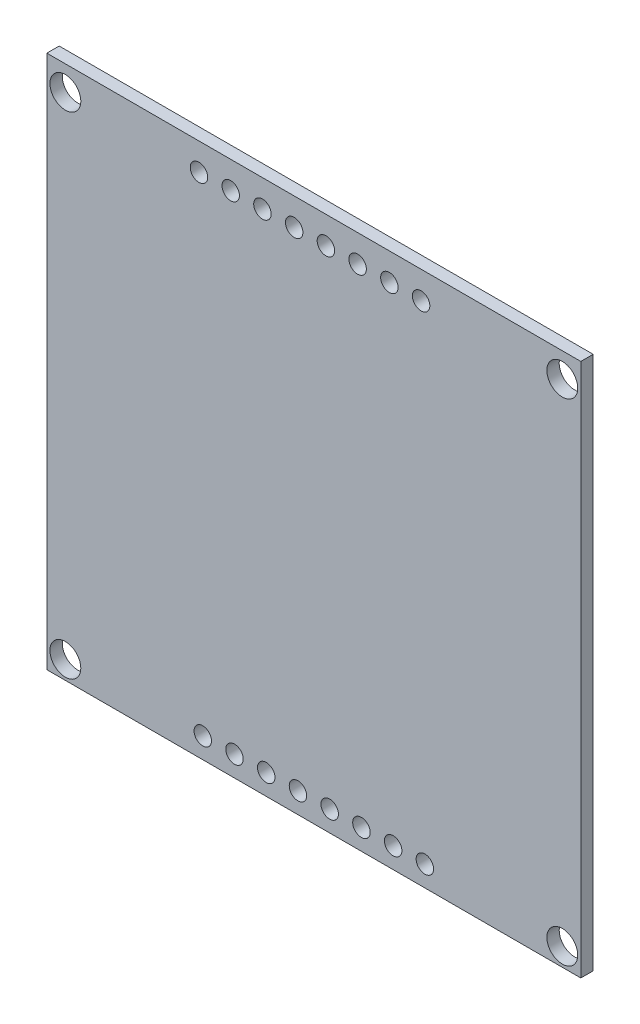
ISO-10303-21;
HEADER;
FILE_DESCRIPTION(('STEP AP214'),'2;1');
FILE_NAME('part.step','',(''),(''),'','','');
FILE_SCHEMA(('AUTOMOTIVE_DESIGN { 1 0 10303 214 1 1 1 1 }'));
ENDSEC;
DATA;
#1=APPLICATION_CONTEXT('core data for automotive mechanical design processes');
#2=APPLICATION_PROTOCOL_DEFINITION('international standard','automotive_design',2000,#1);
#3=PRODUCT_CONTEXT('',#1,'mechanical');
#4=PRODUCT('Part','Part','',(#3));
#5=PRODUCT_RELATED_PRODUCT_CATEGORY('part','',(#4));
#6=PRODUCT_DEFINITION_FORMATION('','',#4);
#7=PRODUCT_DEFINITION_CONTEXT('part definition',#1,'design');
#8=PRODUCT_DEFINITION('design','',#6,#7);
#9=PRODUCT_DEFINITION_SHAPE('','',#8);
#10=(LENGTH_UNIT() NAMED_UNIT(*) SI_UNIT(.MILLI.,.METRE.));
#11=(NAMED_UNIT(*) PLANE_ANGLE_UNIT() SI_UNIT($,.RADIAN.));
#12=(NAMED_UNIT(*) SI_UNIT($,.STERADIAN.) SOLID_ANGLE_UNIT());
#13=UNCERTAINTY_MEASURE_WITH_UNIT(LENGTH_MEASURE(1.E-05),#10,'distance_accuracy_value','');
#14=(GEOMETRIC_REPRESENTATION_CONTEXT(3) GLOBAL_UNCERTAINTY_ASSIGNED_CONTEXT((#13)) GLOBAL_UNIT_ASSIGNED_CONTEXT((#10,
#11,#12)) REPRESENTATION_CONTEXT('',''));
#15=CARTESIAN_POINT('',(0.,0.,0.));
#16=DIRECTION('',(0.,0.,1.));
#17=DIRECTION('',(1.,0.,0.));
#18=AXIS2_PLACEMENT_3D('',#15,#16,#17);
#19=CARTESIAN_POINT('',(0.,0.,1.));
#20=DIRECTION('',(0.,0.,-1.));
#21=DIRECTION('',(-1.,0.,0.));
#22=AXIS2_PLACEMENT_3D('',#19,#20,#21);
#23=PLANE('',#22);
#24=CARTESIAN_POINT('',(1.5,1.47673648000744,1.));
#25=DIRECTION('',(0.,0.,1.));
#26=DIRECTION('',(1.,0.,0.));
#27=AXIS2_PLACEMENT_3D('',#24,#25,#26);
#28=CIRCLE('',#27,1.25);
#29=CARTESIAN_POINT('',(2.75,1.47673648000744,1.));
#30=VERTEX_POINT('',#29);
#31=EDGE_CURVE('E219',#30,#30,#28,.T.);
#32=ORIENTED_EDGE('',*,*,#31,.F.);
#33=EDGE_LOOP('',(#32));
#34=FACE_BOUND('',#33,.T.);
#35=CARTESIAN_POINT('',(41.75,1.47673648000744,1.));
#36=DIRECTION('',(0.,0.,1.));
#37=DIRECTION('',(-1.,0.,0.));
#38=AXIS2_PLACEMENT_3D('',#35,#36,#37);
#39=CIRCLE('',#38,1.25);
#40=CARTESIAN_POINT('',(40.5,1.47673648000744,1.));
#41=VERTEX_POINT('',#40);
#42=EDGE_CURVE('E207',#41,#41,#39,.T.);
#43=ORIENTED_EDGE('',*,*,#42,.F.);
#44=EDGE_LOOP('',(#43));
#45=FACE_BOUND('',#44,.T.);
#46=CARTESIAN_POINT('',(20.34,1.67673648000722,1.));
#47=DIRECTION('',(0.,0.,1.));
#48=DIRECTION('',(-1.,0.,0.));
#49=AXIS2_PLACEMENT_3D('',#46,#47,#48);
#50=CIRCLE('',#49,0.707384328542562);
#51=CARTESIAN_POINT('',(19.6326156714574,1.67673648000722,1.));
#52=VERTEX_POINT('',#51);
#53=EDGE_CURVE('E195',#52,#52,#50,.T.);
#54=ORIENTED_EDGE('',*,*,#53,.F.);
#55=EDGE_LOOP('',(#54));
#56=FACE_BOUND('',#55,.T.);
#57=CARTESIAN_POINT('',(25.48,1.67673648000723,1.));
#58=DIRECTION('',(0.,0.,1.));
#59=DIRECTION('',(-1.,0.,0.));
#60=AXIS2_PLACEMENT_3D('',#57,#58,#59);
#61=CIRCLE('',#60,0.707384328542562);
#62=CARTESIAN_POINT('',(24.7726156714574,1.67673648000723,1.));
#63=VERTEX_POINT('',#62);
#64=EDGE_CURVE('E183',#63,#63,#61,.T.);
#65=ORIENTED_EDGE('',*,*,#64,.F.);
#66=EDGE_LOOP('',(#65));
#67=FACE_BOUND('',#66,.T.);
#68=CARTESIAN_POINT('',(30.62,1.67673648000723,1.));
#69=DIRECTION('',(0.,0.,1.));
#70=DIRECTION('',(-1.,0.,0.));
#71=AXIS2_PLACEMENT_3D('',#68,#69,#70);
#72=CIRCLE('',#71,0.707384328542566);
#73=CARTESIAN_POINT('',(29.9126156714574,1.67673648000723,1.));
#74=VERTEX_POINT('',#73);
#75=EDGE_CURVE('E171',#74,#74,#72,.T.);
#76=ORIENTED_EDGE('',*,*,#75,.F.);
#77=EDGE_LOOP('',(#76));
#78=FACE_BOUND('',#77,.T.);
#79=CARTESIAN_POINT('',(30.3125670065612,41.0314532498455,1.));
#80=DIRECTION('',(0.,0.,1.));
#81=DIRECTION('',(1.,0.,0.));
#82=AXIS2_PLACEMENT_3D('',#79,#80,#81);
#83=CIRCLE('',#82,0.707384328542565);
#84=CARTESIAN_POINT('',(31.0199513351037,41.0314532498455,1.));
#85=VERTEX_POINT('',#84);
#86=EDGE_CURVE('E159',#85,#85,#83,.T.);
#87=ORIENTED_EDGE('',*,*,#86,.F.);
#88=EDGE_LOOP('',(#87));
#89=FACE_BOUND('',#88,.T.);
#90=CARTESIAN_POINT('',(25.1725697380948,41.0367523213182,1.));
#91=DIRECTION('',(0.,0.,1.));
#92=DIRECTION('',(1.,0.,0.));
#93=AXIS2_PLACEMENT_3D('',#90,#91,#92);
#94=CIRCLE('',#93,0.707384328542558);
#95=CARTESIAN_POINT('',(25.8799540666374,41.0367523213182,1.));
#96=VERTEX_POINT('',#95);
#97=EDGE_CURVE('E147',#96,#96,#94,.T.);
#98=ORIENTED_EDGE('',*,*,#97,.F.);
#99=EDGE_LOOP('',(#98));
#100=FACE_BOUND('',#99,.T.);
#101=CARTESIAN_POINT('',(20.0325724696285,41.0420513927909,1.));
#102=DIRECTION('',(0.,0.,1.));
#103=DIRECTION('',(1.,0.,0.));
#104=AXIS2_PLACEMENT_3D('',#101,#102,#103);
#105=CIRCLE('',#104,0.707384328542558);
#106=CARTESIAN_POINT('',(20.739956798171,41.0420513927909,1.));
#107=VERTEX_POINT('',#106);
#108=EDGE_CURVE('E135',#107,#107,#105,.T.);
#109=ORIENTED_EDGE('',*,*,#108,.F.);
#110=EDGE_LOOP('',(#109));
#111=FACE_BOUND('',#110,.T.);
#112=CARTESIAN_POINT('',(14.8925752011621,41.0473504642636,1.));
#113=DIRECTION('',(0.,0.,1.));
#114=DIRECTION('',(1.,0.,0.));
#115=AXIS2_PLACEMENT_3D('',#112,#113,#114);
#116=CIRCLE('',#115,0.707384328542558);
#117=CARTESIAN_POINT('',(15.5999595297047,41.0473504642636,1.));
#118=VERTEX_POINT('',#117);
#119=EDGE_CURVE('E123',#118,#118,#116,.T.);
#120=ORIENTED_EDGE('',*,*,#119,.F.);
#121=EDGE_LOOP('',(#120));
#122=FACE_BOUND('',#121,.T.);
#123=CARTESIAN_POINT('',(12.3225765669289,41.05,1.));
#124=DIRECTION('',(0.,0.,1.));
#125=DIRECTION('',(1.,0.,0.));
#126=AXIS2_PLACEMENT_3D('',#123,#124,#125);
#127=CIRCLE('',#126,0.70738432854256);
#128=CARTESIAN_POINT('',(13.0299608954715,41.05,1.));
#129=VERTEX_POINT('',#128);
#130=EDGE_CURVE('E102',#129,#129,#127,.T.);
#131=ORIENTED_EDGE('',*,*,#130,.F.);
#132=EDGE_LOOP('',(#131));
#133=FACE_BOUND('',#132,.T.);
#134=DIRECTION('',(0.,-1.,0.));
#135=VECTOR('',#134,1.);
#136=CARTESIAN_POINT('',(0.,0.,1.));
#137=LINE('',#136,#135);
#138=CARTESIAN_POINT('',(0.,43.25,1.));
#139=VERTEX_POINT('',#138);
#140=CARTESIAN_POINT('',(0.,0.,1.));
#141=VERTEX_POINT('',#140);
#142=EDGE_CURVE('E87',#139,#141,#137,.T.);
#143=ORIENTED_EDGE('',*,*,#142,.T.);
#144=DIRECTION('',(1.,0.,0.));
#145=VECTOR('',#144,1.);
#146=CARTESIAN_POINT('',(0.,0.,1.));
#147=LINE('',#146,#145);
#148=CARTESIAN_POINT('',(43.25,0.,1.));
#149=VERTEX_POINT('',#148);
#150=EDGE_CURVE('E82',#141,#149,#147,.T.);
#151=ORIENTED_EDGE('',*,*,#150,.T.);
#152=DIRECTION('',(0.,1.,0.));
#153=VECTOR('',#152,1.);
#154=CARTESIAN_POINT('',(43.25,0.,1.));
#155=LINE('',#154,#153);
#156=CARTESIAN_POINT('',(43.25,43.25,1.));
#157=VERTEX_POINT('',#156);
#158=EDGE_CURVE('E85',#149,#157,#155,.T.);
#159=ORIENTED_EDGE('',*,*,#158,.T.);
#160=DIRECTION('',(-1.,0.,0.));
#161=VECTOR('',#160,1.);
#162=CARTESIAN_POINT('',(0.,43.25,1.));
#163=LINE('',#162,#161);
#164=EDGE_CURVE('E52',#157,#139,#163,.T.);
#165=ORIENTED_EDGE('',*,*,#164,.T.);
#166=EDGE_LOOP('',(#143,#151,#159,#165));
#167=FACE_BOUND('',#166,.T.);
#168=CARTESIAN_POINT('',(41.75,41.25,1.));
#169=DIRECTION('',(0.,0.,1.));
#170=DIRECTION('',(1.,0.,0.));
#171=AXIS2_PLACEMENT_3D('',#168,#169,#170);
#172=CIRCLE('',#171,1.25);
#173=CARTESIAN_POINT('',(43.,41.25,1.));
#174=VERTEX_POINT('',#173);
#175=EDGE_CURVE('E117',#174,#174,#172,.T.);
#176=ORIENTED_EDGE('',*,*,#175,.F.);
#177=EDGE_LOOP('',(#176));
#178=FACE_BOUND('',#177,.T.);
#179=CARTESIAN_POINT('',(17.4625738353953,41.0447009285273,1.));
#180=DIRECTION('',(0.,0.,1.));
#181=DIRECTION('',(1.,0.,0.));
#182=AXIS2_PLACEMENT_3D('',#179,#180,#181);
#183=CIRCLE('',#182,0.707384328542562);
#184=CARTESIAN_POINT('',(18.1699581639378,41.0447009285273,1.));
#185=VERTEX_POINT('',#184);
#186=EDGE_CURVE('E129',#185,#185,#183,.T.);
#187=ORIENTED_EDGE('',*,*,#186,.F.);
#188=EDGE_LOOP('',(#187));
#189=FACE_BOUND('',#188,.T.);
#190=CARTESIAN_POINT('',(22.6025711038616,41.0394018570546,1.));
#191=DIRECTION('',(0.,0.,1.));
#192=DIRECTION('',(1.,0.,0.));
#193=AXIS2_PLACEMENT_3D('',#190,#191,#192);
#194=CIRCLE('',#193,0.707384328542562);
#195=CARTESIAN_POINT('',(23.3099554324042,41.0394018570546,1.));
#196=VERTEX_POINT('',#195);
#197=EDGE_CURVE('E141',#196,#196,#194,.T.);
#198=ORIENTED_EDGE('',*,*,#197,.F.);
#199=EDGE_LOOP('',(#198));
#200=FACE_BOUND('',#199,.T.);
#201=CARTESIAN_POINT('',(27.742568372328,41.0341027855819,1.));
#202=DIRECTION('',(0.,0.,1.));
#203=DIRECTION('',(1.,0.,0.));
#204=AXIS2_PLACEMENT_3D('',#201,#202,#203);
#205=CIRCLE('',#204,0.707384328542558);
#206=CARTESIAN_POINT('',(28.4499527008705,41.0341027855819,1.));
#207=VERTEX_POINT('',#206);
#208=EDGE_CURVE('E153',#207,#207,#205,.T.);
#209=ORIENTED_EDGE('',*,*,#208,.F.);
#210=EDGE_LOOP('',(#209));
#211=FACE_BOUND('',#210,.T.);
#212=CARTESIAN_POINT('',(1.5,41.25,1.));
#213=DIRECTION('',(0.,0.,1.));
#214=DIRECTION('',(-1.,0.,0.));
#215=AXIS2_PLACEMENT_3D('',#212,#213,#214);
#216=CIRCLE('',#215,1.25);
#217=CARTESIAN_POINT('',(0.250000000000003,41.25,1.));
#218=VERTEX_POINT('',#217);
#219=EDGE_CURVE('E165',#218,#218,#216,.T.);
#220=ORIENTED_EDGE('',*,*,#219,.F.);
#221=EDGE_LOOP('',(#220));
#222=FACE_BOUND('',#221,.T.);
#223=CARTESIAN_POINT('',(28.05,1.67673648000723,1.));
#224=DIRECTION('',(0.,0.,1.));
#225=DIRECTION('',(-1.,0.,0.));
#226=AXIS2_PLACEMENT_3D('',#223,#224,#225);
#227=CIRCLE('',#226,0.707384328542562);
#228=CARTESIAN_POINT('',(27.3426156714574,1.67673648000723,1.));
#229=VERTEX_POINT('',#228);
#230=EDGE_CURVE('E177',#229,#229,#227,.T.);
#231=ORIENTED_EDGE('',*,*,#230,.F.);
#232=EDGE_LOOP('',(#231));
#233=FACE_BOUND('',#232,.T.);
#234=CARTESIAN_POINT('',(22.91,1.67673648000722,1.));
#235=DIRECTION('',(0.,0.,1.));
#236=DIRECTION('',(-1.,0.,0.));
#237=AXIS2_PLACEMENT_3D('',#234,#235,#236);
#238=CIRCLE('',#237,0.707384328542562);
#239=CARTESIAN_POINT('',(22.2026156714574,1.67673648000722,1.));
#240=VERTEX_POINT('',#239);
#241=EDGE_CURVE('E189',#240,#240,#238,.T.);
#242=ORIENTED_EDGE('',*,*,#241,.F.);
#243=EDGE_LOOP('',(#242));
#244=FACE_BOUND('',#243,.T.);
#245=CARTESIAN_POINT('',(17.77,1.67673648000722,1.));
#246=DIRECTION('',(0.,0.,1.));
#247=DIRECTION('',(-1.,0.,0.));
#248=AXIS2_PLACEMENT_3D('',#245,#246,#247);
#249=CIRCLE('',#248,0.707384328542562);
#250=CARTESIAN_POINT('',(17.0626156714574,1.67673648000722,1.));
#251=VERTEX_POINT('',#250);
#252=EDGE_CURVE('E201',#251,#251,#249,.T.);
#253=ORIENTED_EDGE('',*,*,#252,.F.);
#254=EDGE_LOOP('',(#253));
#255=FACE_BOUND('',#254,.T.);
#256=CARTESIAN_POINT('',(15.2,1.67673648000722,1.));
#257=DIRECTION('',(0.,0.,1.));
#258=DIRECTION('',(-1.,0.,0.));
#259=AXIS2_PLACEMENT_3D('',#256,#257,#258);
#260=CIRCLE('',#259,0.707384328542562);
#261=CARTESIAN_POINT('',(14.4926156714574,1.67673648000722,1.));
#262=VERTEX_POINT('',#261);
#263=EDGE_CURVE('E213',#262,#262,#260,.T.);
#264=ORIENTED_EDGE('',*,*,#263,.F.);
#265=EDGE_LOOP('',(#264));
#266=FACE_BOUND('',#265,.T.);
#267=CARTESIAN_POINT('',(12.63,1.67673648000723,1.));
#268=DIRECTION('',(0.,0.,1.));
#269=DIRECTION('',(-1.,0.,0.));
#270=AXIS2_PLACEMENT_3D('',#267,#268,#269);
#271=CIRCLE('',#270,0.707384328542562);
#272=CARTESIAN_POINT('',(11.9226156714574,1.67673648000723,1.));
#273=VERTEX_POINT('',#272);
#274=EDGE_CURVE('E225',#273,#273,#271,.T.);
#275=ORIENTED_EDGE('',*,*,#274,.F.);
#276=EDGE_LOOP('',(#275));
#277=FACE_BOUND('',#276,.T.);
#278=ADVANCED_FACE('F35',(#34,#45,#56,#67,#78,#89,#100,#111,#122,#133,#167,#178,#189,#200,#211,
#222,#233,#244,#255,#266,#277),#23,.F.);
#279=CARTESIAN_POINT('',(0.,0.,0.));
#280=DIRECTION('',(0.,0.,-1.));
#281=DIRECTION('',(-1.,0.,0.));
#282=AXIS2_PLACEMENT_3D('',#279,#280,#281);
#283=PLANE('',#282);
#284=CARTESIAN_POINT('',(1.5,1.47673648000744,0.));
#285=DIRECTION('',(0.,0.,1.));
#286=DIRECTION('',(1.,0.,0.));
#287=AXIS2_PLACEMENT_3D('',#284,#285,#286);
#288=CIRCLE('',#287,1.25);
#289=CARTESIAN_POINT('',(2.75,1.47673648000744,0.));
#290=VERTEX_POINT('',#289);
#291=EDGE_CURVE('E222',#290,#290,#288,.T.);
#292=ORIENTED_EDGE('',*,*,#291,.T.);
#293=EDGE_LOOP('',(#292));
#294=FACE_BOUND('',#293,.T.);
#295=CARTESIAN_POINT('',(41.75,1.47673648000744,0.));
#296=DIRECTION('',(0.,0.,1.));
#297=DIRECTION('',(-1.,0.,0.));
#298=AXIS2_PLACEMENT_3D('',#295,#296,#297);
#299=CIRCLE('',#298,1.25);
#300=CARTESIAN_POINT('',(40.5,1.47673648000744,0.));
#301=VERTEX_POINT('',#300);
#302=EDGE_CURVE('E210',#301,#301,#299,.T.);
#303=ORIENTED_EDGE('',*,*,#302,.T.);
#304=EDGE_LOOP('',(#303));
#305=FACE_BOUND('',#304,.T.);
#306=CARTESIAN_POINT('',(20.34,1.67673648000722,0.));
#307=DIRECTION('',(0.,0.,1.));
#308=DIRECTION('',(-1.,0.,0.));
#309=AXIS2_PLACEMENT_3D('',#306,#307,#308);
#310=CIRCLE('',#309,0.707384328542562);
#311=CARTESIAN_POINT('',(19.6326156714574,1.67673648000722,0.));
#312=VERTEX_POINT('',#311);
#313=EDGE_CURVE('E198',#312,#312,#310,.T.);
#314=ORIENTED_EDGE('',*,*,#313,.T.);
#315=EDGE_LOOP('',(#314));
#316=FACE_BOUND('',#315,.T.);
#317=CARTESIAN_POINT('',(25.48,1.67673648000723,0.));
#318=DIRECTION('',(0.,0.,1.));
#319=DIRECTION('',(-1.,0.,0.));
#320=AXIS2_PLACEMENT_3D('',#317,#318,#319);
#321=CIRCLE('',#320,0.707384328542562);
#322=CARTESIAN_POINT('',(24.7726156714574,1.67673648000723,0.));
#323=VERTEX_POINT('',#322);
#324=EDGE_CURVE('E186',#323,#323,#321,.T.);
#325=ORIENTED_EDGE('',*,*,#324,.T.);
#326=EDGE_LOOP('',(#325));
#327=FACE_BOUND('',#326,.T.);
#328=CARTESIAN_POINT('',(30.62,1.67673648000723,0.));
#329=DIRECTION('',(0.,0.,1.));
#330=DIRECTION('',(-1.,0.,0.));
#331=AXIS2_PLACEMENT_3D('',#328,#329,#330);
#332=CIRCLE('',#331,0.707384328542566);
#333=CARTESIAN_POINT('',(29.9126156714574,1.67673648000723,0.));
#334=VERTEX_POINT('',#333);
#335=EDGE_CURVE('E174',#334,#334,#332,.T.);
#336=ORIENTED_EDGE('',*,*,#335,.T.);
#337=EDGE_LOOP('',(#336));
#338=FACE_BOUND('',#337,.T.);
#339=CARTESIAN_POINT('',(30.3125670065612,41.0314532498455,0.));
#340=DIRECTION('',(0.,0.,1.));
#341=DIRECTION('',(1.,0.,0.));
#342=AXIS2_PLACEMENT_3D('',#339,#340,#341);
#343=CIRCLE('',#342,0.707384328542565);
#344=CARTESIAN_POINT('',(31.0199513351037,41.0314532498455,0.));
#345=VERTEX_POINT('',#344);
#346=EDGE_CURVE('E162',#345,#345,#343,.T.);
#347=ORIENTED_EDGE('',*,*,#346,.T.);
#348=EDGE_LOOP('',(#347));
#349=FACE_BOUND('',#348,.T.);
#350=CARTESIAN_POINT('',(25.1725697380948,41.0367523213182,0.));
#351=DIRECTION('',(0.,0.,1.));
#352=DIRECTION('',(1.,0.,0.));
#353=AXIS2_PLACEMENT_3D('',#350,#351,#352);
#354=CIRCLE('',#353,0.707384328542558);
#355=CARTESIAN_POINT('',(25.8799540666374,41.0367523213182,0.));
#356=VERTEX_POINT('',#355);
#357=EDGE_CURVE('E150',#356,#356,#354,.T.);
#358=ORIENTED_EDGE('',*,*,#357,.T.);
#359=EDGE_LOOP('',(#358));
#360=FACE_BOUND('',#359,.T.);
#361=CARTESIAN_POINT('',(20.0325724696285,41.0420513927909,0.));
#362=DIRECTION('',(0.,0.,1.));
#363=DIRECTION('',(1.,0.,0.));
#364=AXIS2_PLACEMENT_3D('',#361,#362,#363);
#365=CIRCLE('',#364,0.707384328542558);
#366=CARTESIAN_POINT('',(20.739956798171,41.0420513927909,0.));
#367=VERTEX_POINT('',#366);
#368=EDGE_CURVE('E138',#367,#367,#365,.T.);
#369=ORIENTED_EDGE('',*,*,#368,.T.);
#370=EDGE_LOOP('',(#369));
#371=FACE_BOUND('',#370,.T.);
#372=CARTESIAN_POINT('',(14.8925752011621,41.0473504642636,0.));
#373=DIRECTION('',(0.,0.,1.));
#374=DIRECTION('',(1.,0.,0.));
#375=AXIS2_PLACEMENT_3D('',#372,#373,#374);
#376=CIRCLE('',#375,0.707384328542558);
#377=CARTESIAN_POINT('',(15.5999595297047,41.0473504642636,0.));
#378=VERTEX_POINT('',#377);
#379=EDGE_CURVE('E126',#378,#378,#376,.T.);
#380=ORIENTED_EDGE('',*,*,#379,.T.);
#381=EDGE_LOOP('',(#380));
#382=FACE_BOUND('',#381,.T.);
#383=CARTESIAN_POINT('',(12.3225765669289,41.05,0.));
#384=DIRECTION('',(0.,0.,1.));
#385=DIRECTION('',(1.,0.,0.));
#386=AXIS2_PLACEMENT_3D('',#383,#384,#385);
#387=CIRCLE('',#386,0.70738432854256);
#388=CARTESIAN_POINT('',(13.0299608954715,41.05,0.));
#389=VERTEX_POINT('',#388);
#390=EDGE_CURVE('E114',#389,#389,#387,.T.);
#391=ORIENTED_EDGE('',*,*,#390,.T.);
#392=EDGE_LOOP('',(#391));
#393=FACE_BOUND('',#392,.T.);
#394=DIRECTION('',(0.,-1.,0.));
#395=VECTOR('',#394,1.);
#396=CARTESIAN_POINT('',(0.,0.,0.));
#397=LINE('',#396,#395);
#398=CARTESIAN_POINT('',(0.,43.25,0.));
#399=VERTEX_POINT('',#398);
#400=CARTESIAN_POINT('',(0.,0.,0.));
#401=VERTEX_POINT('',#400);
#402=EDGE_CURVE('E99',#399,#401,#397,.T.);
#403=ORIENTED_EDGE('',*,*,#402,.F.);
#404=DIRECTION('',(-1.,0.,0.));
#405=VECTOR('',#404,1.);
#406=CARTESIAN_POINT('',(0.,43.25,0.));
#407=LINE('',#406,#405);
#408=CARTESIAN_POINT('',(43.25,43.25,0.));
#409=VERTEX_POINT('',#408);
#410=EDGE_CURVE('E75',#409,#399,#407,.T.);
#411=ORIENTED_EDGE('',*,*,#410,.F.);
#412=DIRECTION('',(0.,1.,0.));
#413=VECTOR('',#412,1.);
#414=CARTESIAN_POINT('',(43.25,0.,0.));
#415=LINE('',#414,#413);
#416=CARTESIAN_POINT('',(43.25,0.,0.));
#417=VERTEX_POINT('',#416);
#418=EDGE_CURVE('E69',#417,#409,#415,.T.);
#419=ORIENTED_EDGE('',*,*,#418,.F.);
#420=DIRECTION('',(1.,0.,0.));
#421=VECTOR('',#420,1.);
#422=CARTESIAN_POINT('',(0.,0.,0.));
#423=LINE('',#422,#421);
#424=EDGE_CURVE('E91',#401,#417,#423,.T.);
#425=ORIENTED_EDGE('',*,*,#424,.F.);
#426=EDGE_LOOP('',(#403,#411,#419,#425));
#427=FACE_BOUND('',#426,.T.);
#428=CARTESIAN_POINT('',(41.75,41.25,0.));
#429=DIRECTION('',(0.,0.,1.));
#430=DIRECTION('',(1.,0.,0.));
#431=AXIS2_PLACEMENT_3D('',#428,#429,#430);
#432=CIRCLE('',#431,1.25);
#433=CARTESIAN_POINT('',(43.,41.25,0.));
#434=VERTEX_POINT('',#433);
#435=EDGE_CURVE('E120',#434,#434,#432,.T.);
#436=ORIENTED_EDGE('',*,*,#435,.T.);
#437=EDGE_LOOP('',(#436));
#438=FACE_BOUND('',#437,.T.);
#439=CARTESIAN_POINT('',(17.4625738353953,41.0447009285273,0.));
#440=DIRECTION('',(0.,0.,1.));
#441=DIRECTION('',(1.,0.,0.));
#442=AXIS2_PLACEMENT_3D('',#439,#440,#441);
#443=CIRCLE('',#442,0.707384328542562);
#444=CARTESIAN_POINT('',(18.1699581639378,41.0447009285273,0.));
#445=VERTEX_POINT('',#444);
#446=EDGE_CURVE('E132',#445,#445,#443,.T.);
#447=ORIENTED_EDGE('',*,*,#446,.T.);
#448=EDGE_LOOP('',(#447));
#449=FACE_BOUND('',#448,.T.);
#450=CARTESIAN_POINT('',(22.6025711038616,41.0394018570546,0.));
#451=DIRECTION('',(0.,0.,1.));
#452=DIRECTION('',(1.,0.,0.));
#453=AXIS2_PLACEMENT_3D('',#450,#451,#452);
#454=CIRCLE('',#453,0.707384328542562);
#455=CARTESIAN_POINT('',(23.3099554324042,41.0394018570546,0.));
#456=VERTEX_POINT('',#455);
#457=EDGE_CURVE('E144',#456,#456,#454,.T.);
#458=ORIENTED_EDGE('',*,*,#457,.T.);
#459=EDGE_LOOP('',(#458));
#460=FACE_BOUND('',#459,.T.);
#461=CARTESIAN_POINT('',(27.742568372328,41.0341027855819,0.));
#462=DIRECTION('',(0.,0.,1.));
#463=DIRECTION('',(1.,0.,0.));
#464=AXIS2_PLACEMENT_3D('',#461,#462,#463);
#465=CIRCLE('',#464,0.707384328542558);
#466=CARTESIAN_POINT('',(28.4499527008705,41.0341027855819,0.));
#467=VERTEX_POINT('',#466);
#468=EDGE_CURVE('E156',#467,#467,#465,.T.);
#469=ORIENTED_EDGE('',*,*,#468,.T.);
#470=EDGE_LOOP('',(#469));
#471=FACE_BOUND('',#470,.T.);
#472=CARTESIAN_POINT('',(1.5,41.25,0.));
#473=DIRECTION('',(0.,0.,1.));
#474=DIRECTION('',(-1.,0.,0.));
#475=AXIS2_PLACEMENT_3D('',#472,#473,#474);
#476=CIRCLE('',#475,1.25);
#477=CARTESIAN_POINT('',(0.250000000000003,41.25,0.));
#478=VERTEX_POINT('',#477);
#479=EDGE_CURVE('E168',#478,#478,#476,.T.);
#480=ORIENTED_EDGE('',*,*,#479,.T.);
#481=EDGE_LOOP('',(#480));
#482=FACE_BOUND('',#481,.T.);
#483=CARTESIAN_POINT('',(28.05,1.67673648000723,0.));
#484=DIRECTION('',(0.,0.,1.));
#485=DIRECTION('',(-1.,0.,0.));
#486=AXIS2_PLACEMENT_3D('',#483,#484,#485);
#487=CIRCLE('',#486,0.707384328542562);
#488=CARTESIAN_POINT('',(27.3426156714574,1.67673648000723,0.));
#489=VERTEX_POINT('',#488);
#490=EDGE_CURVE('E180',#489,#489,#487,.T.);
#491=ORIENTED_EDGE('',*,*,#490,.T.);
#492=EDGE_LOOP('',(#491));
#493=FACE_BOUND('',#492,.T.);
#494=CARTESIAN_POINT('',(22.91,1.67673648000722,0.));
#495=DIRECTION('',(0.,0.,1.));
#496=DIRECTION('',(-1.,0.,0.));
#497=AXIS2_PLACEMENT_3D('',#494,#495,#496);
#498=CIRCLE('',#497,0.707384328542562);
#499=CARTESIAN_POINT('',(22.2026156714574,1.67673648000722,0.));
#500=VERTEX_POINT('',#499);
#501=EDGE_CURVE('E192',#500,#500,#498,.T.);
#502=ORIENTED_EDGE('',*,*,#501,.T.);
#503=EDGE_LOOP('',(#502));
#504=FACE_BOUND('',#503,.T.);
#505=CARTESIAN_POINT('',(17.77,1.67673648000722,0.));
#506=DIRECTION('',(0.,0.,1.));
#507=DIRECTION('',(-1.,0.,0.));
#508=AXIS2_PLACEMENT_3D('',#505,#506,#507);
#509=CIRCLE('',#508,0.707384328542562);
#510=CARTESIAN_POINT('',(17.0626156714574,1.67673648000722,0.));
#511=VERTEX_POINT('',#510);
#512=EDGE_CURVE('E204',#511,#511,#509,.T.);
#513=ORIENTED_EDGE('',*,*,#512,.T.);
#514=EDGE_LOOP('',(#513));
#515=FACE_BOUND('',#514,.T.);
#516=CARTESIAN_POINT('',(15.2,1.67673648000722,0.));
#517=DIRECTION('',(0.,0.,1.));
#518=DIRECTION('',(-1.,0.,0.));
#519=AXIS2_PLACEMENT_3D('',#516,#517,#518);
#520=CIRCLE('',#519,0.707384328542562);
#521=CARTESIAN_POINT('',(14.4926156714574,1.67673648000722,0.));
#522=VERTEX_POINT('',#521);
#523=EDGE_CURVE('E216',#522,#522,#520,.T.);
#524=ORIENTED_EDGE('',*,*,#523,.T.);
#525=EDGE_LOOP('',(#524));
#526=FACE_BOUND('',#525,.T.);
#527=CARTESIAN_POINT('',(12.63,1.67673648000723,0.));
#528=DIRECTION('',(0.,0.,1.));
#529=DIRECTION('',(-1.,0.,0.));
#530=AXIS2_PLACEMENT_3D('',#527,#528,#529);
#531=CIRCLE('',#530,0.707384328542562);
#532=CARTESIAN_POINT('',(11.9226156714574,1.67673648000723,0.));
#533=VERTEX_POINT('',#532);
#534=EDGE_CURVE('E228',#533,#533,#531,.T.);
#535=ORIENTED_EDGE('',*,*,#534,.T.);
#536=EDGE_LOOP('',(#535));
#537=FACE_BOUND('',#536,.T.);
#538=ADVANCED_FACE('F110',(#294,#305,#316,#327,#338,#349,#360,#371,#382,#393,#427,#438,#449,
#460,#471,#482,#493,#504,#515,#526,#537),#283,.T.);
#539=CARTESIAN_POINT('',(0.,0.,1.));
#540=DIRECTION('',(1.,0.,0.));
#541=DIRECTION('',(0.,0.,-1.));
#542=AXIS2_PLACEMENT_3D('',#539,#540,#541);
#543=PLANE('',#542);
#544=ORIENTED_EDGE('',*,*,#402,.T.);
#545=DIRECTION('',(0.,0.,-1.));
#546=VECTOR('',#545,1.);
#547=CARTESIAN_POINT('',(0.,0.,1.));
#548=LINE('',#547,#546);
#549=EDGE_CURVE('E11',#141,#401,#548,.T.);
#550=ORIENTED_EDGE('',*,*,#549,.F.);
#551=ORIENTED_EDGE('',*,*,#142,.F.);
#552=DIRECTION('',(0.,0.,-1.));
#553=VECTOR('',#552,1.);
#554=CARTESIAN_POINT('',(0.,43.25,1.));
#555=LINE('',#554,#553);
#556=EDGE_CURVE('E95',#139,#399,#555,.T.);
#557=ORIENTED_EDGE('',*,*,#556,.T.);
#558=EDGE_LOOP('',(#544,#550,#551,#557));
#559=FACE_BOUND('',#558,.T.);
#560=ADVANCED_FACE('F37',(#559),#543,.F.);
#561=CARTESIAN_POINT('',(0.,0.,1.));
#562=DIRECTION('',(0.,1.,0.));
#563=DIRECTION('',(0.,0.,1.));
#564=AXIS2_PLACEMENT_3D('',#561,#562,#563);
#565=PLANE('',#564);
#566=ORIENTED_EDGE('',*,*,#424,.T.);
#567=DIRECTION('',(0.,0.,-1.));
#568=VECTOR('',#567,1.);
#569=CARTESIAN_POINT('',(43.25,0.,1.));
#570=LINE('',#569,#568);
#571=EDGE_CURVE('E44',#149,#417,#570,.T.);
#572=ORIENTED_EDGE('',*,*,#571,.F.);
#573=ORIENTED_EDGE('',*,*,#150,.F.);
#574=ORIENTED_EDGE('',*,*,#549,.T.);
#575=EDGE_LOOP('',(#566,#572,#573,#574));
#576=FACE_BOUND('',#575,.T.);
#577=ADVANCED_FACE('F90',(#576),#565,.F.);
#578=CARTESIAN_POINT('',(43.25,0.,1.));
#579=DIRECTION('',(-1.,0.,0.));
#580=DIRECTION('',(0.,0.,1.));
#581=AXIS2_PLACEMENT_3D('',#578,#579,#580);
#582=PLANE('',#581);
#583=ORIENTED_EDGE('',*,*,#418,.T.);
#584=DIRECTION('',(0.,0.,-1.));
#585=VECTOR('',#584,1.);
#586=CARTESIAN_POINT('',(43.25,43.25,1.));
#587=LINE('',#586,#585);
#588=EDGE_CURVE('E92',#157,#409,#587,.T.);
#589=ORIENTED_EDGE('',*,*,#588,.F.);
#590=ORIENTED_EDGE('',*,*,#158,.F.);
#591=ORIENTED_EDGE('',*,*,#571,.T.);
#592=EDGE_LOOP('',(#583,#589,#590,#591));
#593=FACE_BOUND('',#592,.T.);
#594=ADVANCED_FACE('F93',(#593),#582,.F.);
#595=CARTESIAN_POINT('',(0.,43.25,1.));
#596=DIRECTION('',(0.,-1.,0.));
#597=DIRECTION('',(0.,0.,-1.));
#598=AXIS2_PLACEMENT_3D('',#595,#596,#597);
#599=PLANE('',#598);
#600=ORIENTED_EDGE('',*,*,#410,.T.);
#601=ORIENTED_EDGE('',*,*,#556,.F.);
#602=ORIENTED_EDGE('',*,*,#164,.F.);
#603=ORIENTED_EDGE('',*,*,#588,.T.);
#604=EDGE_LOOP('',(#600,#601,#602,#603));
#605=FACE_BOUND('',#604,.T.);
#606=ADVANCED_FACE('F107',(#605),#599,.F.);
#607=CARTESIAN_POINT('',(12.3225765669289,41.05,1.));
#608=DIRECTION('',(0.,0.,-1.));
#609=DIRECTION('',(-1.,0.,0.));
#610=AXIS2_PLACEMENT_3D('',#607,#608,#609);
#611=CYLINDRICAL_SURFACE('',#610,0.70738432854256);
#612=ORIENTED_EDGE('',*,*,#130,.T.);
#613=EDGE_LOOP('',(#612));
#614=FACE_BOUND('',#613,.T.);
#615=ORIENTED_EDGE('',*,*,#390,.F.);
#616=EDGE_LOOP('',(#615));
#617=FACE_BOUND('',#616,.T.);
#618=ADVANCED_FACE('F248',(#614,#617),#611,.F.);
#619=CARTESIAN_POINT('',(41.75,41.25,1.));
#620=DIRECTION('',(0.,0.,-1.));
#621=DIRECTION('',(-1.,0.,0.));
#622=AXIS2_PLACEMENT_3D('',#619,#620,#621);
#623=CYLINDRICAL_SURFACE('',#622,1.25);
#624=ORIENTED_EDGE('',*,*,#175,.T.);
#625=EDGE_LOOP('',(#624));
#626=FACE_BOUND('',#625,.T.);
#627=ORIENTED_EDGE('',*,*,#435,.F.);
#628=EDGE_LOOP('',(#627));
#629=FACE_BOUND('',#628,.T.);
#630=ADVANCED_FACE('F304',(#626,#629),#623,.F.);
#631=CARTESIAN_POINT('',(14.8925752011621,41.0473504642636,1.));
#632=DIRECTION('',(0.,0.,-1.));
#633=DIRECTION('',(-1.,0.,0.));
#634=AXIS2_PLACEMENT_3D('',#631,#632,#633);
#635=CYLINDRICAL_SURFACE('',#634,0.707384328542558);
#636=ORIENTED_EDGE('',*,*,#119,.T.);
#637=EDGE_LOOP('',(#636));
#638=FACE_BOUND('',#637,.T.);
#639=ORIENTED_EDGE('',*,*,#379,.F.);
#640=EDGE_LOOP('',(#639));
#641=FACE_BOUND('',#640,.T.);
#642=ADVANCED_FACE('F312',(#638,#641),#635,.F.);
#643=CARTESIAN_POINT('',(17.4625738353953,41.0447009285273,1.));
#644=DIRECTION('',(0.,0.,-1.));
#645=DIRECTION('',(-1.,0.,0.));
#646=AXIS2_PLACEMENT_3D('',#643,#644,#645);
#647=CYLINDRICAL_SURFACE('',#646,0.707384328542562);
#648=ORIENTED_EDGE('',*,*,#186,.T.);
#649=EDGE_LOOP('',(#648));
#650=FACE_BOUND('',#649,.T.);
#651=ORIENTED_EDGE('',*,*,#446,.F.);
#652=EDGE_LOOP('',(#651));
#653=FACE_BOUND('',#652,.T.);
#654=ADVANCED_FACE('F320',(#650,#653),#647,.F.);
#655=CARTESIAN_POINT('',(20.0325724696285,41.0420513927909,1.));
#656=DIRECTION('',(0.,0.,-1.));
#657=DIRECTION('',(-1.,0.,0.));
#658=AXIS2_PLACEMENT_3D('',#655,#656,#657);
#659=CYLINDRICAL_SURFACE('',#658,0.707384328542558);
#660=ORIENTED_EDGE('',*,*,#108,.T.);
#661=EDGE_LOOP('',(#660));
#662=FACE_BOUND('',#661,.T.);
#663=ORIENTED_EDGE('',*,*,#368,.F.);
#664=EDGE_LOOP('',(#663));
#665=FACE_BOUND('',#664,.T.);
#666=ADVANCED_FACE('F329',(#662,#665),#659,.F.);
#667=CARTESIAN_POINT('',(22.6025711038616,41.0394018570546,1.));
#668=DIRECTION('',(0.,0.,-1.));
#669=DIRECTION('',(-1.,0.,0.));
#670=AXIS2_PLACEMENT_3D('',#667,#668,#669);
#671=CYLINDRICAL_SURFACE('',#670,0.707384328542562);
#672=ORIENTED_EDGE('',*,*,#197,.T.);
#673=EDGE_LOOP('',(#672));
#674=FACE_BOUND('',#673,.T.);
#675=ORIENTED_EDGE('',*,*,#457,.F.);
#676=EDGE_LOOP('',(#675));
#677=FACE_BOUND('',#676,.T.);
#678=ADVANCED_FACE('F338',(#674,#677),#671,.F.);
#679=CARTESIAN_POINT('',(25.1725697380948,41.0367523213182,1.));
#680=DIRECTION('',(0.,0.,-1.));
#681=DIRECTION('',(-1.,0.,0.));
#682=AXIS2_PLACEMENT_3D('',#679,#680,#681);
#683=CYLINDRICAL_SURFACE('',#682,0.707384328542558);
#684=ORIENTED_EDGE('',*,*,#97,.T.);
#685=EDGE_LOOP('',(#684));
#686=FACE_BOUND('',#685,.T.);
#687=ORIENTED_EDGE('',*,*,#357,.F.);
#688=EDGE_LOOP('',(#687));
#689=FACE_BOUND('',#688,.T.);
#690=ADVANCED_FACE('F347',(#686,#689),#683,.F.);
#691=CARTESIAN_POINT('',(27.742568372328,41.0341027855819,1.));
#692=DIRECTION('',(0.,0.,-1.));
#693=DIRECTION('',(-1.,0.,0.));
#694=AXIS2_PLACEMENT_3D('',#691,#692,#693);
#695=CYLINDRICAL_SURFACE('',#694,0.707384328542558);
#696=ORIENTED_EDGE('',*,*,#208,.T.);
#697=EDGE_LOOP('',(#696));
#698=FACE_BOUND('',#697,.T.);
#699=ORIENTED_EDGE('',*,*,#468,.F.);
#700=EDGE_LOOP('',(#699));
#701=FACE_BOUND('',#700,.T.);
#702=ADVANCED_FACE('F356',(#698,#701),#695,.F.);
#703=CARTESIAN_POINT('',(30.3125670065612,41.0314532498455,1.));
#704=DIRECTION('',(0.,0.,-1.));
#705=DIRECTION('',(-1.,0.,0.));
#706=AXIS2_PLACEMENT_3D('',#703,#704,#705);
#707=CYLINDRICAL_SURFACE('',#706,0.707384328542565);
#708=ORIENTED_EDGE('',*,*,#86,.T.);
#709=EDGE_LOOP('',(#708));
#710=FACE_BOUND('',#709,.T.);
#711=ORIENTED_EDGE('',*,*,#346,.F.);
#712=EDGE_LOOP('',(#711));
#713=FACE_BOUND('',#712,.T.);
#714=ADVANCED_FACE('F365',(#710,#713),#707,.F.);
#715=CARTESIAN_POINT('',(1.5,41.25,1.));
#716=DIRECTION('',(0.,0.,-1.));
#717=DIRECTION('',(-1.,0.,0.));
#718=AXIS2_PLACEMENT_3D('',#715,#716,#717);
#719=CYLINDRICAL_SURFACE('',#718,1.25);
#720=ORIENTED_EDGE('',*,*,#219,.T.);
#721=EDGE_LOOP('',(#720));
#722=FACE_BOUND('',#721,.T.);
#723=ORIENTED_EDGE('',*,*,#479,.F.);
#724=EDGE_LOOP('',(#723));
#725=FACE_BOUND('',#724,.T.);
#726=ADVANCED_FACE('F374',(#722,#725),#719,.F.);
#727=CARTESIAN_POINT('',(30.62,1.67673648000723,1.));
#728=DIRECTION('',(0.,0.,-1.));
#729=DIRECTION('',(-1.,0.,0.));
#730=AXIS2_PLACEMENT_3D('',#727,#728,#729);
#731=CYLINDRICAL_SURFACE('',#730,0.707384328542566);
#732=ORIENTED_EDGE('',*,*,#75,.T.);
#733=EDGE_LOOP('',(#732));
#734=FACE_BOUND('',#733,.T.);
#735=ORIENTED_EDGE('',*,*,#335,.F.);
#736=EDGE_LOOP('',(#735));
#737=FACE_BOUND('',#736,.T.);
#738=ADVANCED_FACE('F383',(#734,#737),#731,.F.);
#739=CARTESIAN_POINT('',(28.05,1.67673648000723,1.));
#740=DIRECTION('',(0.,0.,-1.));
#741=DIRECTION('',(-1.,0.,0.));
#742=AXIS2_PLACEMENT_3D('',#739,#740,#741);
#743=CYLINDRICAL_SURFACE('',#742,0.707384328542562);
#744=ORIENTED_EDGE('',*,*,#230,.T.);
#745=EDGE_LOOP('',(#744));
#746=FACE_BOUND('',#745,.T.);
#747=ORIENTED_EDGE('',*,*,#490,.F.);
#748=EDGE_LOOP('',(#747));
#749=FACE_BOUND('',#748,.T.);
#750=ADVANCED_FACE('F392',(#746,#749),#743,.F.);
#751=CARTESIAN_POINT('',(25.48,1.67673648000723,1.));
#752=DIRECTION('',(0.,0.,-1.));
#753=DIRECTION('',(-1.,0.,0.));
#754=AXIS2_PLACEMENT_3D('',#751,#752,#753);
#755=CYLINDRICAL_SURFACE('',#754,0.707384328542562);
#756=ORIENTED_EDGE('',*,*,#64,.T.);
#757=EDGE_LOOP('',(#756));
#758=FACE_BOUND('',#757,.T.);
#759=ORIENTED_EDGE('',*,*,#324,.F.);
#760=EDGE_LOOP('',(#759));
#761=FACE_BOUND('',#760,.T.);
#762=ADVANCED_FACE('F401',(#758,#761),#755,.F.);
#763=CARTESIAN_POINT('',(22.91,1.67673648000722,1.));
#764=DIRECTION('',(0.,0.,-1.));
#765=DIRECTION('',(-1.,0.,0.));
#766=AXIS2_PLACEMENT_3D('',#763,#764,#765);
#767=CYLINDRICAL_SURFACE('',#766,0.707384328542562);
#768=ORIENTED_EDGE('',*,*,#241,.T.);
#769=EDGE_LOOP('',(#768));
#770=FACE_BOUND('',#769,.T.);
#771=ORIENTED_EDGE('',*,*,#501,.F.);
#772=EDGE_LOOP('',(#771));
#773=FACE_BOUND('',#772,.T.);
#774=ADVANCED_FACE('F410',(#770,#773),#767,.F.);
#775=CARTESIAN_POINT('',(20.34,1.67673648000722,1.));
#776=DIRECTION('',(0.,0.,-1.));
#777=DIRECTION('',(-1.,0.,0.));
#778=AXIS2_PLACEMENT_3D('',#775,#776,#777);
#779=CYLINDRICAL_SURFACE('',#778,0.707384328542562);
#780=ORIENTED_EDGE('',*,*,#53,.T.);
#781=EDGE_LOOP('',(#780));
#782=FACE_BOUND('',#781,.T.);
#783=ORIENTED_EDGE('',*,*,#313,.F.);
#784=EDGE_LOOP('',(#783));
#785=FACE_BOUND('',#784,.T.);
#786=ADVANCED_FACE('F419',(#782,#785),#779,.F.);
#787=CARTESIAN_POINT('',(17.77,1.67673648000722,1.));
#788=DIRECTION('',(0.,0.,-1.));
#789=DIRECTION('',(-1.,0.,0.));
#790=AXIS2_PLACEMENT_3D('',#787,#788,#789);
#791=CYLINDRICAL_SURFACE('',#790,0.707384328542562);
#792=ORIENTED_EDGE('',*,*,#252,.T.);
#793=EDGE_LOOP('',(#792));
#794=FACE_BOUND('',#793,.T.);
#795=ORIENTED_EDGE('',*,*,#512,.F.);
#796=EDGE_LOOP('',(#795));
#797=FACE_BOUND('',#796,.T.);
#798=ADVANCED_FACE('F428',(#794,#797),#791,.F.);
#799=CARTESIAN_POINT('',(41.75,1.47673648000744,1.));
#800=DIRECTION('',(0.,0.,-1.));
#801=DIRECTION('',(-1.,0.,0.));
#802=AXIS2_PLACEMENT_3D('',#799,#800,#801);
#803=CYLINDRICAL_SURFACE('',#802,1.25);
#804=ORIENTED_EDGE('',*,*,#42,.T.);
#805=EDGE_LOOP('',(#804));
#806=FACE_BOUND('',#805,.T.);
#807=ORIENTED_EDGE('',*,*,#302,.F.);
#808=EDGE_LOOP('',(#807));
#809=FACE_BOUND('',#808,.T.);
#810=ADVANCED_FACE('F437',(#806,#809),#803,.F.);
#811=CARTESIAN_POINT('',(15.2,1.67673648000722,1.));
#812=DIRECTION('',(0.,0.,-1.));
#813=DIRECTION('',(-1.,0.,0.));
#814=AXIS2_PLACEMENT_3D('',#811,#812,#813);
#815=CYLINDRICAL_SURFACE('',#814,0.707384328542562);
#816=ORIENTED_EDGE('',*,*,#263,.T.);
#817=EDGE_LOOP('',(#816));
#818=FACE_BOUND('',#817,.T.);
#819=ORIENTED_EDGE('',*,*,#523,.F.);
#820=EDGE_LOOP('',(#819));
#821=FACE_BOUND('',#820,.T.);
#822=ADVANCED_FACE('F446',(#818,#821),#815,.F.);
#823=CARTESIAN_POINT('',(1.5,1.47673648000744,1.));
#824=DIRECTION('',(0.,0.,-1.));
#825=DIRECTION('',(-1.,0.,0.));
#826=AXIS2_PLACEMENT_3D('',#823,#824,#825);
#827=CYLINDRICAL_SURFACE('',#826,1.25);
#828=ORIENTED_EDGE('',*,*,#31,.T.);
#829=EDGE_LOOP('',(#828));
#830=FACE_BOUND('',#829,.T.);
#831=ORIENTED_EDGE('',*,*,#291,.F.);
#832=EDGE_LOOP('',(#831));
#833=FACE_BOUND('',#832,.T.);
#834=ADVANCED_FACE('F455',(#830,#833),#827,.F.);
#835=CARTESIAN_POINT('',(12.63,1.67673648000723,1.));
#836=DIRECTION('',(0.,0.,-1.));
#837=DIRECTION('',(-1.,0.,0.));
#838=AXIS2_PLACEMENT_3D('',#835,#836,#837);
#839=CYLINDRICAL_SURFACE('',#838,0.707384328542562);
#840=ORIENTED_EDGE('',*,*,#274,.T.);
#841=EDGE_LOOP('',(#840));
#842=FACE_BOUND('',#841,.T.);
#843=ORIENTED_EDGE('',*,*,#534,.F.);
#844=EDGE_LOOP('',(#843));
#845=FACE_BOUND('',#844,.T.);
#846=ADVANCED_FACE('F234',(#842,#845),#839,.F.);
#847=CLOSED_SHELL('',(#278,#538,#560,#577,#594,#606,#618,#630,#642,#654,#666,#678,#690,#702,
#714,#726,#738,#750,#762,#774,#786,#798,#810,#822,#834,#846));
#848=MANIFOLD_SOLID_BREP('B2',#847);
#849=ADVANCED_BREP_SHAPE_REPRESENTATION('',(#18,#848),#14);
#850=SHAPE_DEFINITION_REPRESENTATION(#9,#849);
ENDSEC;
END-ISO-10303-21;
